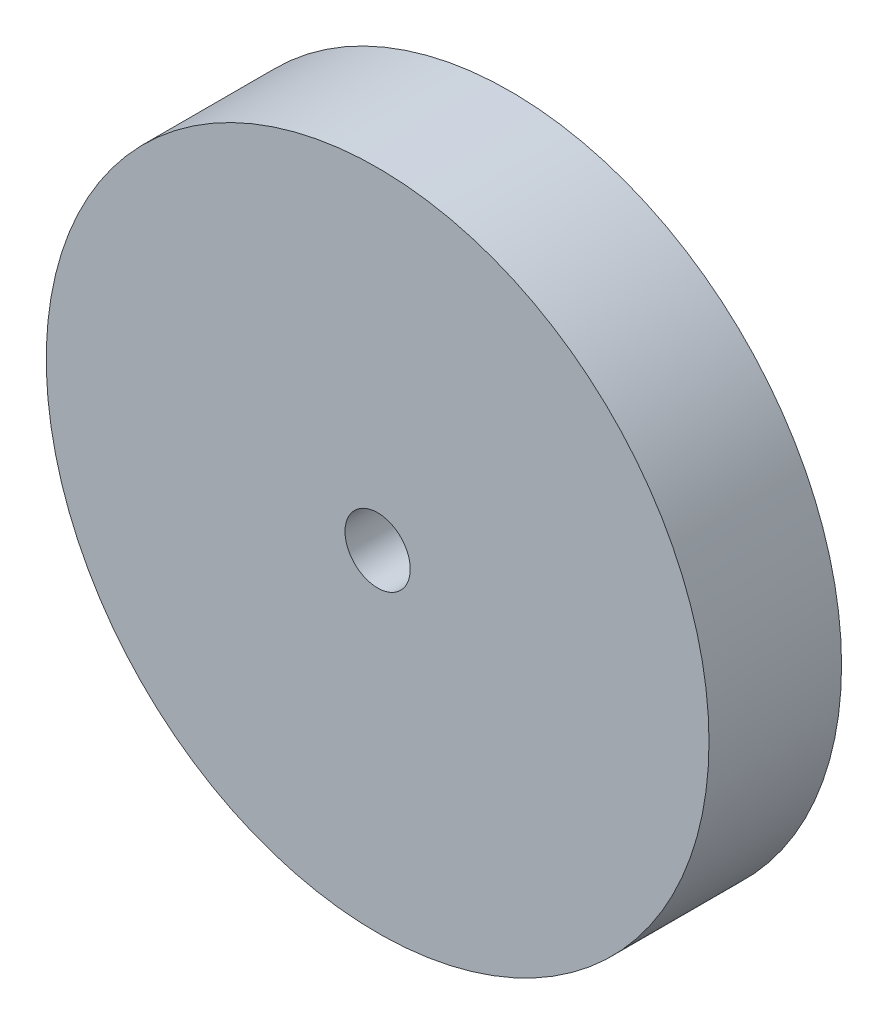
ISO-10303-21;
HEADER;
FILE_DESCRIPTION(('STEP AP214'),'2;1');
FILE_NAME('part.step','',(''),(''),'','','');
FILE_SCHEMA(('AUTOMOTIVE_DESIGN { 1 0 10303 214 1 1 1 1 }'));
ENDSEC;
DATA;
#1=APPLICATION_CONTEXT('core data for automotive mechanical design processes');
#2=APPLICATION_PROTOCOL_DEFINITION('international standard','automotive_design',2000,#1);
#3=PRODUCT_CONTEXT('',#1,'mechanical');
#4=PRODUCT('Part','Part','',(#3));
#5=PRODUCT_RELATED_PRODUCT_CATEGORY('part','',(#4));
#6=PRODUCT_DEFINITION_FORMATION('','',#4);
#7=PRODUCT_DEFINITION_CONTEXT('part definition',#1,'design');
#8=PRODUCT_DEFINITION('design','',#6,#7);
#9=PRODUCT_DEFINITION_SHAPE('','',#8);
#10=(LENGTH_UNIT() NAMED_UNIT(*) SI_UNIT(.MILLI.,.METRE.));
#11=(NAMED_UNIT(*) PLANE_ANGLE_UNIT() SI_UNIT($,.RADIAN.));
#12=(NAMED_UNIT(*) SI_UNIT($,.STERADIAN.) SOLID_ANGLE_UNIT());
#13=UNCERTAINTY_MEASURE_WITH_UNIT(LENGTH_MEASURE(1.E-05),#10,'distance_accuracy_value','');
#14=(GEOMETRIC_REPRESENTATION_CONTEXT(3) GLOBAL_UNCERTAINTY_ASSIGNED_CONTEXT((#13)) GLOBAL_UNIT_ASSIGNED_CONTEXT((#10,
#11,#12)) REPRESENTATION_CONTEXT('',''));
#15=CARTESIAN_POINT('',(0.,0.,0.));
#16=DIRECTION('',(0.,0.,1.));
#17=DIRECTION('',(1.,0.,0.));
#18=AXIS2_PLACEMENT_3D('',#15,#16,#17);
#19=CARTESIAN_POINT('',(0.,0.,50.8));
#20=DIRECTION('',(0.,0.,-1.));
#21=DIRECTION('',(-1.,0.,0.));
#22=AXIS2_PLACEMENT_3D('',#19,#20,#21);
#23=CYLINDRICAL_SURFACE('',#22,127.);
#24=CARTESIAN_POINT('',(0.,0.,50.8));
#25=DIRECTION('',(0.,0.,1.));
#26=DIRECTION('',(1.,0.,0.));
#27=AXIS2_PLACEMENT_3D('',#24,#25,#26);
#28=CIRCLE('',#27,127.);
#29=CARTESIAN_POINT('',(127.,0.,50.8));
#30=VERTEX_POINT('',#29);
#31=EDGE_CURVE('E10',#30,#30,#28,.T.);
#32=ORIENTED_EDGE('',*,*,#31,.F.);
#33=EDGE_LOOP('',(#32));
#34=FACE_BOUND('',#33,.T.);
#35=CARTESIAN_POINT('',(0.,0.,0.));
#36=DIRECTION('',(0.,0.,1.));
#37=DIRECTION('',(1.,0.,0.));
#38=AXIS2_PLACEMENT_3D('',#35,#36,#37);
#39=CIRCLE('',#38,127.);
#40=CARTESIAN_POINT('',(127.,0.,0.));
#41=VERTEX_POINT('',#40);
#42=EDGE_CURVE('E34',#41,#41,#39,.T.);
#43=ORIENTED_EDGE('',*,*,#42,.T.);
#44=EDGE_LOOP('',(#43));
#45=FACE_BOUND('',#44,.T.);
#46=ADVANCED_FACE('F31',(#34,#45),#23,.T.);
#47=CARTESIAN_POINT('',(0.,0.,50.8));
#48=DIRECTION('',(0.,0.,1.));
#49=DIRECTION('',(1.,0.,0.));
#50=AXIS2_PLACEMENT_3D('',#47,#48,#49);
#51=PLANE('',#50);
#52=CARTESIAN_POINT('',(0.,0.,50.8));
#53=DIRECTION('',(0.,0.,-1.));
#54=DIRECTION('',(-1.,0.,0.));
#55=AXIS2_PLACEMENT_3D('',#52,#53,#54);
#56=CIRCLE('',#55,12.4999999999999);
#57=CARTESIAN_POINT('',(-12.4999999999999,0.,50.8));
#58=VERTEX_POINT('',#57);
#59=EDGE_CURVE('E41',#58,#58,#56,.T.);
#60=ORIENTED_EDGE('',*,*,#59,.T.);
#61=EDGE_LOOP('',(#60));
#62=FACE_BOUND('',#61,.T.);
#63=ORIENTED_EDGE('',*,*,#31,.T.);
#64=EDGE_LOOP('',(#63));
#65=FACE_BOUND('',#64,.T.);
#66=ADVANCED_FACE('F54',(#62,#65),#51,.T.);
#67=CARTESIAN_POINT('',(0.,0.,0.));
#68=DIRECTION('',(0.,0.,1.));
#69=DIRECTION('',(1.,0.,0.));
#70=AXIS2_PLACEMENT_3D('',#67,#68,#69);
#71=PLANE('',#70);
#72=CARTESIAN_POINT('',(0.,0.,0.));
#73=DIRECTION('',(0.,0.,-1.));
#74=DIRECTION('',(-1.,0.,0.));
#75=AXIS2_PLACEMENT_3D('',#72,#73,#74);
#76=CIRCLE('',#75,12.5);
#77=CARTESIAN_POINT('',(-12.5,0.,0.));
#78=VERTEX_POINT('',#77);
#79=EDGE_CURVE('E45',#78,#78,#76,.T.);
#80=ORIENTED_EDGE('',*,*,#79,.F.);
#81=EDGE_LOOP('',(#80));
#82=FACE_BOUND('',#81,.T.);
#83=ORIENTED_EDGE('',*,*,#42,.F.);
#84=EDGE_LOOP('',(#83));
#85=FACE_BOUND('',#84,.T.);
#86=ADVANCED_FACE('F51',(#82,#85),#71,.F.);
#87=CARTESIAN_POINT('',(0.,0.,0.));
#88=DIRECTION('',(0.,0.,-1.));
#89=DIRECTION('',(-1.,0.,0.));
#90=AXIS2_PLACEMENT_3D('',#87,#88,#89);
#91=CYLINDRICAL_SURFACE('',#90,12.4999999999999);
#92=ORIENTED_EDGE('',*,*,#59,.F.);
#93=EDGE_LOOP('',(#92));
#94=FACE_BOUND('',#93,.T.);
#95=ORIENTED_EDGE('',*,*,#79,.T.);
#96=EDGE_LOOP('',(#95));
#97=FACE_BOUND('',#96,.T.);
#98=ADVANCED_FACE('F49',(#94,#97),#91,.F.);
#99=CLOSED_SHELL('',(#46,#66,#86,#98));
#100=MANIFOLD_SOLID_BREP('B2',#99);
#101=ADVANCED_BREP_SHAPE_REPRESENTATION('',(#18,#100),#14);
#102=SHAPE_DEFINITION_REPRESENTATION(#9,#101);
ENDSEC;
END-ISO-10303-21;
